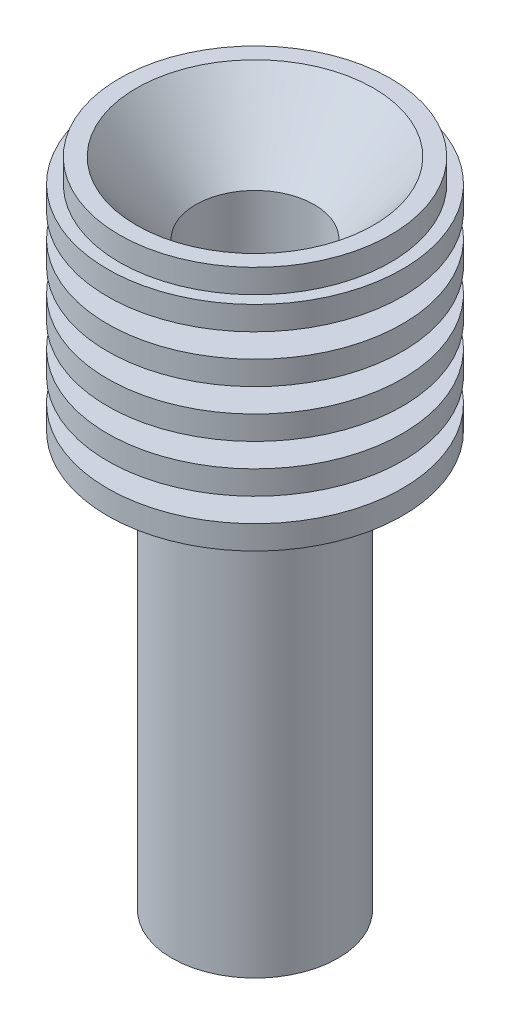
ISO-10303-21;
HEADER;
FILE_DESCRIPTION(('STEP AP214'),'2;1');
FILE_NAME('part.step','',(''),(''),'','','');
FILE_SCHEMA(('AUTOMOTIVE_DESIGN { 1 0 10303 214 1 1 1 1 }'));
ENDSEC;
DATA;
#1=APPLICATION_CONTEXT('core data for automotive mechanical design processes');
#2=APPLICATION_PROTOCOL_DEFINITION('international standard','automotive_design',2000,#1);
#3=PRODUCT_CONTEXT('',#1,'mechanical');
#4=PRODUCT('Part','Part','',(#3));
#5=PRODUCT_RELATED_PRODUCT_CATEGORY('part','',(#4));
#6=PRODUCT_DEFINITION_FORMATION('','',#4);
#7=PRODUCT_DEFINITION_CONTEXT('part definition',#1,'design');
#8=PRODUCT_DEFINITION('design','',#6,#7);
#9=PRODUCT_DEFINITION_SHAPE('','',#8);
#10=(LENGTH_UNIT() NAMED_UNIT(*) SI_UNIT(.MILLI.,.METRE.));
#11=(NAMED_UNIT(*) PLANE_ANGLE_UNIT() SI_UNIT($,.RADIAN.));
#12=(NAMED_UNIT(*) SI_UNIT($,.STERADIAN.) SOLID_ANGLE_UNIT());
#13=UNCERTAINTY_MEASURE_WITH_UNIT(LENGTH_MEASURE(1.E-05),#10,'distance_accuracy_value','');
#14=(GEOMETRIC_REPRESENTATION_CONTEXT(3) GLOBAL_UNCERTAINTY_ASSIGNED_CONTEXT((#13)) GLOBAL_UNIT_ASSIGNED_CONTEXT((#10,
#11,#12)) REPRESENTATION_CONTEXT('',''));
#15=CARTESIAN_POINT('',(0.,0.,0.));
#16=DIRECTION('',(0.,0.,1.));
#17=DIRECTION('',(1.,0.,0.));
#18=AXIS2_PLACEMENT_3D('',#15,#16,#17);
#19=CARTESIAN_POINT('',(0.,35.,0.));
#20=DIRECTION('',(0.,1.,0.));
#21=DIRECTION('',(0.,0.,1.));
#22=AXIS2_PLACEMENT_3D('',#19,#20,#21);
#23=CYLINDRICAL_SURFACE('',#22,12.425);
#24=CARTESIAN_POINT('',(0.,35.,0.));
#25=DIRECTION('',(0.,1.,0.));
#26=DIRECTION('',(0.,0.,1.));
#27=AXIS2_PLACEMENT_3D('',#24,#25,#26);
#28=CIRCLE('',#27,12.425);
#29=CARTESIAN_POINT('',(0.,35.,12.425));
#30=VERTEX_POINT('',#29);
#31=EDGE_CURVE('E52',#30,#30,#28,.T.);
#32=ORIENTED_EDGE('',*,*,#31,.T.);
#33=EDGE_LOOP('',(#32));
#34=FACE_BOUND('',#33,.T.);
#35=CARTESIAN_POINT('',(0.,37.,0.));
#36=DIRECTION('',(0.,1.,0.));
#37=DIRECTION('',(0.,0.,1.));
#38=AXIS2_PLACEMENT_3D('',#35,#36,#37);
#39=CIRCLE('',#38,12.425);
#40=CARTESIAN_POINT('',(0.,37.,12.425));
#41=VERTEX_POINT('',#40);
#42=EDGE_CURVE('E44',#41,#41,#39,.F.);
#43=ORIENTED_EDGE('',*,*,#42,.T.);
#44=EDGE_LOOP('',(#43));
#45=FACE_BOUND('',#44,.T.);
#46=ADVANCED_FACE('F40',(#34,#45),#23,.T.);
#47=CARTESIAN_POINT('',(0.,8.,0.));
#48=DIRECTION('',(0.,1.,0.));
#49=DIRECTION('',(0.,0.,1.));
#50=AXIS2_PLACEMENT_3D('',#47,#48,#49);
#51=CYLINDRICAL_SURFACE('',#50,5.);
#52=CARTESIAN_POINT('',(0.,8.,0.));
#53=DIRECTION('',(0.,1.,0.));
#54=DIRECTION('',(0.,0.,1.));
#55=AXIS2_PLACEMENT_3D('',#52,#53,#54);
#56=CIRCLE('',#55,5.);
#57=CARTESIAN_POINT('',(0.,8.,5.));
#58=VERTEX_POINT('',#57);
#59=EDGE_CURVE('E57',#58,#58,#56,.T.);
#60=ORIENTED_EDGE('',*,*,#59,.F.);
#61=EDGE_LOOP('',(#60));
#62=FACE_BOUND('',#61,.T.);
#63=CARTESIAN_POINT('',(0.,49.,0.));
#64=DIRECTION('',(0.,-1.,0.));
#65=DIRECTION('',(0.,0.,-1.));
#66=AXIS2_PLACEMENT_3D('',#63,#64,#65);
#67=CIRCLE('',#66,5.);
#68=CARTESIAN_POINT('',(0.,49.,-5.));
#69=VERTEX_POINT('',#68);
#70=EDGE_CURVE('E66',#69,#69,#67,.T.);
#71=ORIENTED_EDGE('',*,*,#70,.F.);
#72=EDGE_LOOP('',(#71));
#73=FACE_BOUND('',#72,.T.);
#74=ADVANCED_FACE('F147',(#62,#73),#51,.F.);
#75=CARTESIAN_POINT('',(0.,55.,0.));
#76=DIRECTION('',(0.,-1.,0.));
#77=DIRECTION('',(0.,0.,-1.));
#78=AXIS2_PLACEMENT_3D('',#75,#76,#77);
#79=CYLINDRICAL_SURFACE('',#78,7.);
#80=CARTESIAN_POINT('',(0.,0.,0.));
#81=DIRECTION('',(0.,1.,0.));
#82=DIRECTION('',(0.,0.,1.));
#83=AXIS2_PLACEMENT_3D('',#80,#81,#82);
#84=CIRCLE('',#83,7.);
#85=CARTESIAN_POINT('',(0.,0.,7.));
#86=VERTEX_POINT('',#85);
#87=EDGE_CURVE('E48',#86,#86,#84,.T.);
#88=ORIENTED_EDGE('',*,*,#87,.T.);
#89=EDGE_LOOP('',(#88));
#90=FACE_BOUND('',#89,.T.);
#91=CARTESIAN_POINT('',(0.,35.,0.));
#92=DIRECTION('',(0.,1.,0.));
#93=DIRECTION('',(0.,0.,1.));
#94=AXIS2_PLACEMENT_3D('',#91,#92,#93);
#95=CIRCLE('',#94,7.);
#96=CARTESIAN_POINT('',(0.,35.,7.));
#97=VERTEX_POINT('',#96);
#98=EDGE_CURVE('E11',#97,#97,#95,.T.);
#99=ORIENTED_EDGE('',*,*,#98,.F.);
#100=EDGE_LOOP('',(#99));
#101=FACE_BOUND('',#100,.T.);
#102=ADVANCED_FACE('F42',(#90,#101),#79,.T.);
#103=CARTESIAN_POINT('',(0.,0.,0.));
#104=DIRECTION('',(0.,1.,0.));
#105=DIRECTION('',(0.,0.,1.));
#106=AXIS2_PLACEMENT_3D('',#103,#104,#105);
#107=PLANE('',#106);
#108=CARTESIAN_POINT('',(0.,0.,0.));
#109=DIRECTION('',(0.,-1.,0.));
#110=DIRECTION('',(0.,0.,-1.));
#111=AXIS2_PLACEMENT_3D('',#108,#109,#110);
#112=CIRCLE('',#111,3.);
#113=CARTESIAN_POINT('',(0.,0.,-3.));
#114=VERTEX_POINT('',#113);
#115=EDGE_CURVE('E63',#114,#114,#112,.T.);
#116=ORIENTED_EDGE('',*,*,#115,.F.);
#117=EDGE_LOOP('',(#116));
#118=FACE_BOUND('',#117,.T.);
#119=ORIENTED_EDGE('',*,*,#87,.F.);
#120=EDGE_LOOP('',(#119));
#121=FACE_BOUND('',#120,.T.);
#122=ADVANCED_FACE('F397',(#118,#121),#107,.F.);
#123=CARTESIAN_POINT('',(0.,35.,0.));
#124=DIRECTION('',(0.,1.,0.));
#125=DIRECTION('',(0.,0.,1.));
#126=AXIS2_PLACEMENT_3D('',#123,#124,#125);
#127=PLANE('',#126);
#128=ORIENTED_EDGE('',*,*,#98,.T.);
#129=EDGE_LOOP('',(#128));
#130=FACE_BOUND('',#129,.T.);
#131=ORIENTED_EDGE('',*,*,#31,.F.);
#132=EDGE_LOOP('',(#131));
#133=FACE_BOUND('',#132,.T.);
#134=ADVANCED_FACE('F388',(#130,#133),#127,.F.);
#135=CARTESIAN_POINT('',(0.,8.,0.));
#136=DIRECTION('',(0.,1.,0.));
#137=DIRECTION('',(0.,0.,1.));
#138=AXIS2_PLACEMENT_3D('',#135,#136,#137);
#139=PLANE('',#138);
#140=CARTESIAN_POINT('',(0.,8.,0.));
#141=DIRECTION('',(0.,1.,0.));
#142=DIRECTION('',(0.,0.,1.));
#143=AXIS2_PLACEMENT_3D('',#140,#141,#142);
#144=CIRCLE('',#143,3.);
#145=CARTESIAN_POINT('',(0.,8.,3.));
#146=VERTEX_POINT('',#145);
#147=EDGE_CURVE('E60',#146,#146,#144,.F.);
#148=ORIENTED_EDGE('',*,*,#147,.T.);
#149=EDGE_LOOP('',(#148));
#150=FACE_BOUND('',#149,.T.);
#151=ORIENTED_EDGE('',*,*,#59,.T.);
#152=EDGE_LOOP('',(#151));
#153=FACE_BOUND('',#152,.T.);
#154=ADVANCED_FACE('F142',(#150,#153),#139,.T.);
#155=CARTESIAN_POINT('',(0.,16.4852813742386,0.));
#156=DIRECTION('',(0.,-1.,0.));
#157=DIRECTION('',(0.,0.,-1.));
#158=AXIS2_PLACEMENT_3D('',#155,#156,#157);
#159=CYLINDRICAL_SURFACE('',#158,3.);
#160=ORIENTED_EDGE('',*,*,#115,.T.);
#161=EDGE_LOOP('',(#160));
#162=FACE_BOUND('',#161,.T.);
#163=ORIENTED_EDGE('',*,*,#147,.F.);
#164=EDGE_LOOP('',(#163));
#165=FACE_BOUND('',#164,.T.);
#166=ADVANCED_FACE('F131',(#162,#165),#159,.F.);
#167=CARTESIAN_POINT('',(0.,55.,0.));
#168=DIRECTION('',(0.,1.,0.));
#169=DIRECTION('',(0.,0.,1.));
#170=AXIS2_PLACEMENT_3D('',#167,#168,#169);
#171=CONICAL_SURFACE('',#170,10.,0.694738276196703);
#172=ORIENTED_EDGE('',*,*,#70,.T.);
#173=EDGE_LOOP('',(#172));
#174=FACE_BOUND('',#173,.T.);
#175=CARTESIAN_POINT('',(0.,55.,0.));
#176=DIRECTION('',(0.,-1.,0.));
#177=DIRECTION('',(0.,0.,-1.));
#178=AXIS2_PLACEMENT_3D('',#175,#176,#177);
#179=CIRCLE('',#178,10.);
#180=CARTESIAN_POINT('',(0.,55.,-10.));
#181=VERTEX_POINT('',#180);
#182=EDGE_CURVE('E123',#181,#181,#179,.T.);
#183=ORIENTED_EDGE('',*,*,#182,.F.);
#184=EDGE_LOOP('',(#183));
#185=FACE_BOUND('',#184,.T.);
#186=ADVANCED_FACE('F129',(#174,#185),#171,.F.);
#187=CARTESIAN_POINT('',(0.,55.,0.));
#188=DIRECTION('',(0.,1.,0.));
#189=DIRECTION('',(0.,0.,1.));
#190=AXIS2_PLACEMENT_3D('',#187,#188,#189);
#191=PLANE('',#190);
#192=CARTESIAN_POINT('',(0.,55.,0.));
#193=DIRECTION('',(0.,-1.,0.));
#194=DIRECTION('',(0.,0.,-1.));
#195=AXIS2_PLACEMENT_3D('',#192,#193,#194);
#196=CIRCLE('',#195,11.425);
#197=CARTESIAN_POINT('',(0.,55.,-11.425));
#198=VERTEX_POINT('',#197);
#199=EDGE_CURVE('E120',#198,#198,#196,.T.);
#200=ORIENTED_EDGE('',*,*,#199,.F.);
#201=EDGE_LOOP('',(#200));
#202=FACE_BOUND('',#201,.T.);
#203=ORIENTED_EDGE('',*,*,#182,.T.);
#204=EDGE_LOOP('',(#203));
#205=FACE_BOUND('',#204,.T.);
#206=ADVANCED_FACE('F127',(#202,#205),#191,.T.);
#207=CARTESIAN_POINT('',(0.,0.,0.));
#208=DIRECTION('',(0.,-1.,0.));
#209=DIRECTION('',(0.,0.,-1.));
#210=AXIS2_PLACEMENT_3D('',#207,#208,#209);
#211=CYLINDRICAL_SURFACE('',#210,11.425);
#212=ORIENTED_EDGE('',*,*,#199,.T.);
#213=EDGE_LOOP('',(#212));
#214=FACE_BOUND('',#213,.T.);
#215=CARTESIAN_POINT('',(0.,53.,0.));
#216=DIRECTION('',(0.,-1.,0.));
#217=DIRECTION('',(0.,0.,-1.));
#218=AXIS2_PLACEMENT_3D('',#215,#216,#217);
#219=CIRCLE('',#218,11.425);
#220=CARTESIAN_POINT('',(0.,53.,-11.425));
#221=VERTEX_POINT('',#220);
#222=EDGE_CURVE('E117',#221,#221,#219,.T.);
#223=ORIENTED_EDGE('',*,*,#222,.F.);
#224=EDGE_LOOP('',(#223));
#225=FACE_BOUND('',#224,.T.);
#226=ADVANCED_FACE('F138',(#214,#225),#211,.T.);
#227=CARTESIAN_POINT('',(-11.425,53.,0.));
#228=DIRECTION('',(0.,1.,0.));
#229=DIRECTION('',(0.,0.,1.));
#230=AXIS2_PLACEMENT_3D('',#227,#228,#229);
#231=PLANE('',#230);
#232=ORIENTED_EDGE('',*,*,#222,.T.);
#233=EDGE_LOOP('',(#232));
#234=FACE_BOUND('',#233,.T.);
#235=CARTESIAN_POINT('',(0.,53.,0.));
#236=DIRECTION('',(0.,-1.,0.));
#237=DIRECTION('',(0.,0.,-1.));
#238=AXIS2_PLACEMENT_3D('',#235,#236,#237);
#239=CIRCLE('',#238,12.425);
#240=CARTESIAN_POINT('',(0.,53.,-12.425));
#241=VERTEX_POINT('',#240);
#242=EDGE_CURVE('E114',#241,#241,#239,.T.);
#243=ORIENTED_EDGE('',*,*,#242,.F.);
#244=EDGE_LOOP('',(#243));
#245=FACE_BOUND('',#244,.T.);
#246=ADVANCED_FACE('F165',(#234,#245),#231,.T.);
#247=ORIENTED_EDGE('',*,*,#242,.T.);
#248=EDGE_LOOP('',(#247));
#249=FACE_BOUND('',#248,.T.);
#250=CARTESIAN_POINT('',(0.,51.,0.));
#251=DIRECTION('',(0.,-1.,0.));
#252=DIRECTION('',(0.,0.,-1.));
#253=AXIS2_PLACEMENT_3D('',#250,#251,#252);
#254=CIRCLE('',#253,12.425);
#255=CARTESIAN_POINT('',(0.,51.,-12.425));
#256=VERTEX_POINT('',#255);
#257=EDGE_CURVE('E111',#256,#256,#254,.T.);
#258=ORIENTED_EDGE('',*,*,#257,.F.);
#259=EDGE_LOOP('',(#258));
#260=FACE_BOUND('',#259,.T.);
#261=ADVANCED_FACE('F151',(#249,#260),#23,.T.);
#262=CARTESIAN_POINT('',(-8.025,49.,0.));
#263=DIRECTION('',(0.,1.,0.));
#264=DIRECTION('',(0.,0.,1.));
#265=AXIS2_PLACEMENT_3D('',#262,#263,#264);
#266=PLANE('',#265);
#267=CARTESIAN_POINT('',(0.,49.,0.));
#268=DIRECTION('',(0.,-1.,0.));
#269=DIRECTION('',(0.,0.,-1.));
#270=AXIS2_PLACEMENT_3D('',#267,#268,#269);
#271=CIRCLE('',#270,8.025);
#272=CARTESIAN_POINT('',(0.,49.,-8.025));
#273=VERTEX_POINT('',#272);
#274=EDGE_CURVE('E105',#273,#273,#271,.T.);
#275=ORIENTED_EDGE('',*,*,#274,.T.);
#276=EDGE_LOOP('',(#275));
#277=FACE_BOUND('',#276,.T.);
#278=CARTESIAN_POINT('',(0.,49.,0.));
#279=DIRECTION('',(0.,-1.,0.));
#280=DIRECTION('',(0.,0.,-1.));
#281=AXIS2_PLACEMENT_3D('',#278,#279,#280);
#282=CIRCLE('',#281,12.425);
#283=CARTESIAN_POINT('',(0.,49.,-12.425));
#284=VERTEX_POINT('',#283);
#285=EDGE_CURVE('E102',#284,#284,#282,.T.);
#286=ORIENTED_EDGE('',*,*,#285,.F.);
#287=EDGE_LOOP('',(#286));
#288=FACE_BOUND('',#287,.T.);
#289=ADVANCED_FACE('F164',(#277,#288),#266,.T.);
#290=CARTESIAN_POINT('',(0.,0.,0.));
#291=DIRECTION('',(0.,-1.,0.));
#292=DIRECTION('',(0.,0.,-1.));
#293=AXIS2_PLACEMENT_3D('',#290,#291,#292);
#294=CYLINDRICAL_SURFACE('',#293,8.025);
#295=CARTESIAN_POINT('',(0.,51.,0.));
#296=DIRECTION('',(0.,-1.,0.));
#297=DIRECTION('',(0.,0.,-1.));
#298=AXIS2_PLACEMENT_3D('',#295,#296,#297);
#299=CIRCLE('',#298,8.025);
#300=CARTESIAN_POINT('',(0.,51.,-8.025));
#301=VERTEX_POINT('',#300);
#302=EDGE_CURVE('E108',#301,#301,#299,.T.);
#303=ORIENTED_EDGE('',*,*,#302,.T.);
#304=EDGE_LOOP('',(#303));
#305=FACE_BOUND('',#304,.T.);
#306=ORIENTED_EDGE('',*,*,#274,.F.);
#307=EDGE_LOOP('',(#306));
#308=FACE_BOUND('',#307,.T.);
#309=ADVANCED_FACE('F172',(#305,#308),#294,.T.);
#310=CARTESIAN_POINT('',(-12.425,51.,0.));
#311=DIRECTION('',(0.,-1.,0.));
#312=DIRECTION('',(0.,0.,-1.));
#313=AXIS2_PLACEMENT_3D('',#310,#311,#312);
#314=PLANE('',#313);
#315=ORIENTED_EDGE('',*,*,#257,.T.);
#316=EDGE_LOOP('',(#315));
#317=FACE_BOUND('',#316,.T.);
#318=ORIENTED_EDGE('',*,*,#302,.F.);
#319=EDGE_LOOP('',(#318));
#320=FACE_BOUND('',#319,.T.);
#321=ADVANCED_FACE('F180',(#317,#320),#314,.T.);
#322=ORIENTED_EDGE('',*,*,#285,.T.);
#323=EDGE_LOOP('',(#322));
#324=FACE_BOUND('',#323,.T.);
#325=CARTESIAN_POINT('',(0.,47.,0.));
#326=DIRECTION('',(0.,-1.,0.));
#327=DIRECTION('',(0.,0.,-1.));
#328=AXIS2_PLACEMENT_3D('',#325,#326,#327);
#329=CIRCLE('',#328,12.425);
#330=CARTESIAN_POINT('',(0.,47.,-12.425));
#331=VERTEX_POINT('',#330);
#332=EDGE_CURVE('E99',#331,#331,#329,.T.);
#333=ORIENTED_EDGE('',*,*,#332,.F.);
#334=EDGE_LOOP('',(#333));
#335=FACE_BOUND('',#334,.T.);
#336=ADVANCED_FACE('F167',(#324,#335),#23,.T.);
#337=CARTESIAN_POINT('',(-7.,45.,0.));
#338=DIRECTION('',(0.,1.,0.));
#339=DIRECTION('',(0.,0.,1.));
#340=AXIS2_PLACEMENT_3D('',#337,#338,#339);
#341=PLANE('',#340);
#342=CARTESIAN_POINT('',(0.,45.,0.));
#343=DIRECTION('',(0.,-1.,0.));
#344=DIRECTION('',(0.,0.,-1.));
#345=AXIS2_PLACEMENT_3D('',#342,#343,#344);
#346=CIRCLE('',#345,7.);
#347=CARTESIAN_POINT('',(0.,45.,-7.));
#348=VERTEX_POINT('',#347);
#349=EDGE_CURVE('E93',#348,#348,#346,.T.);
#350=ORIENTED_EDGE('',*,*,#349,.T.);
#351=EDGE_LOOP('',(#350));
#352=FACE_BOUND('',#351,.T.);
#353=CARTESIAN_POINT('',(0.,45.,0.));
#354=DIRECTION('',(0.,-1.,0.));
#355=DIRECTION('',(0.,0.,-1.));
#356=AXIS2_PLACEMENT_3D('',#353,#354,#355);
#357=CIRCLE('',#356,12.425);
#358=CARTESIAN_POINT('',(0.,45.,-12.425));
#359=VERTEX_POINT('',#358);
#360=EDGE_CURVE('E90',#359,#359,#357,.T.);
#361=ORIENTED_EDGE('',*,*,#360,.F.);
#362=EDGE_LOOP('',(#361));
#363=FACE_BOUND('',#362,.T.);
#364=ADVANCED_FACE('F179',(#352,#363),#341,.T.);
#365=CARTESIAN_POINT('',(0.,0.,0.));
#366=DIRECTION('',(0.,-1.,0.));
#367=DIRECTION('',(0.,0.,-1.));
#368=AXIS2_PLACEMENT_3D('',#365,#366,#367);
#369=CYLINDRICAL_SURFACE('',#368,7.);
#370=CARTESIAN_POINT('',(0.,47.,0.));
#371=DIRECTION('',(0.,-1.,0.));
#372=DIRECTION('',(0.,0.,-1.));
#373=AXIS2_PLACEMENT_3D('',#370,#371,#372);
#374=CIRCLE('',#373,7.);
#375=CARTESIAN_POINT('',(0.,47.,-7.));
#376=VERTEX_POINT('',#375);
#377=EDGE_CURVE('E96',#376,#376,#374,.T.);
#378=ORIENTED_EDGE('',*,*,#377,.T.);
#379=EDGE_LOOP('',(#378));
#380=FACE_BOUND('',#379,.T.);
#381=ORIENTED_EDGE('',*,*,#349,.F.);
#382=EDGE_LOOP('',(#381));
#383=FACE_BOUND('',#382,.T.);
#384=ADVANCED_FACE('F186',(#380,#383),#369,.T.);
#385=CARTESIAN_POINT('',(-12.425,47.,0.));
#386=DIRECTION('',(0.,-1.,0.));
#387=DIRECTION('',(0.,0.,-1.));
#388=AXIS2_PLACEMENT_3D('',#385,#386,#387);
#389=PLANE('',#388);
#390=ORIENTED_EDGE('',*,*,#332,.T.);
#391=EDGE_LOOP('',(#390));
#392=FACE_BOUND('',#391,.T.);
#393=ORIENTED_EDGE('',*,*,#377,.F.);
#394=EDGE_LOOP('',(#393));
#395=FACE_BOUND('',#394,.T.);
#396=ADVANCED_FACE('F194',(#392,#395),#389,.T.);
#397=ORIENTED_EDGE('',*,*,#360,.T.);
#398=EDGE_LOOP('',(#397));
#399=FACE_BOUND('',#398,.T.);
#400=CARTESIAN_POINT('',(0.,43.,0.));
#401=DIRECTION('',(0.,-1.,0.));
#402=DIRECTION('',(0.,0.,-1.));
#403=AXIS2_PLACEMENT_3D('',#400,#401,#402);
#404=CIRCLE('',#403,12.425);
#405=CARTESIAN_POINT('',(0.,43.,-12.425));
#406=VERTEX_POINT('',#405);
#407=EDGE_CURVE('E87',#406,#406,#404,.T.);
#408=ORIENTED_EDGE('',*,*,#407,.F.);
#409=EDGE_LOOP('',(#408));
#410=FACE_BOUND('',#409,.T.);
#411=ADVANCED_FACE('F162',(#399,#410),#23,.T.);
#412=CARTESIAN_POINT('',(-7.,41.,0.));
#413=DIRECTION('',(0.,1.,0.));
#414=DIRECTION('',(0.,0.,1.));
#415=AXIS2_PLACEMENT_3D('',#412,#413,#414);
#416=PLANE('',#415);
#417=CARTESIAN_POINT('',(0.,41.,0.));
#418=DIRECTION('',(0.,-1.,0.));
#419=DIRECTION('',(0.,0.,-1.));
#420=AXIS2_PLACEMENT_3D('',#417,#418,#419);
#421=CIRCLE('',#420,7.);
#422=CARTESIAN_POINT('',(0.,41.,-7.));
#423=VERTEX_POINT('',#422);
#424=EDGE_CURVE('E81',#423,#423,#421,.T.);
#425=ORIENTED_EDGE('',*,*,#424,.T.);
#426=EDGE_LOOP('',(#425));
#427=FACE_BOUND('',#426,.T.);
#428=CARTESIAN_POINT('',(0.,41.,0.));
#429=DIRECTION('',(0.,-1.,0.));
#430=DIRECTION('',(0.,0.,-1.));
#431=AXIS2_PLACEMENT_3D('',#428,#429,#430);
#432=CIRCLE('',#431,12.425);
#433=CARTESIAN_POINT('',(0.,41.,-12.425));
#434=VERTEX_POINT('',#433);
#435=EDGE_CURVE('E78',#434,#434,#432,.T.);
#436=ORIENTED_EDGE('',*,*,#435,.F.);
#437=EDGE_LOOP('',(#436));
#438=FACE_BOUND('',#437,.T.);
#439=ADVANCED_FACE('F193',(#427,#438),#416,.T.);
#440=CARTESIAN_POINT('',(0.,0.,0.));
#441=DIRECTION('',(0.,-1.,0.));
#442=DIRECTION('',(0.,0.,-1.));
#443=AXIS2_PLACEMENT_3D('',#440,#441,#442);
#444=CYLINDRICAL_SURFACE('',#443,7.);
#445=CARTESIAN_POINT('',(0.,43.,0.));
#446=DIRECTION('',(0.,-1.,0.));
#447=DIRECTION('',(0.,0.,-1.));
#448=AXIS2_PLACEMENT_3D('',#445,#446,#447);
#449=CIRCLE('',#448,7.);
#450=CARTESIAN_POINT('',(0.,43.,-7.));
#451=VERTEX_POINT('',#450);
#452=EDGE_CURVE('E84',#451,#451,#449,.T.);
#453=ORIENTED_EDGE('',*,*,#452,.T.);
#454=EDGE_LOOP('',(#453));
#455=FACE_BOUND('',#454,.T.);
#456=ORIENTED_EDGE('',*,*,#424,.F.);
#457=EDGE_LOOP('',(#456));
#458=FACE_BOUND('',#457,.T.);
#459=ADVANCED_FACE('F200',(#455,#458),#444,.T.);
#460=CARTESIAN_POINT('',(-12.425,43.,0.));
#461=DIRECTION('',(0.,-1.,0.));
#462=DIRECTION('',(0.,0.,-1.));
#463=AXIS2_PLACEMENT_3D('',#460,#461,#462);
#464=PLANE('',#463);
#465=ORIENTED_EDGE('',*,*,#407,.T.);
#466=EDGE_LOOP('',(#465));
#467=FACE_BOUND('',#466,.T.);
#468=ORIENTED_EDGE('',*,*,#452,.F.);
#469=EDGE_LOOP('',(#468));
#470=FACE_BOUND('',#469,.T.);
#471=ADVANCED_FACE('F160',(#467,#470),#464,.T.);
#472=ORIENTED_EDGE('',*,*,#435,.T.);
#473=EDGE_LOOP('',(#472));
#474=FACE_BOUND('',#473,.T.);
#475=CARTESIAN_POINT('',(0.,39.,0.));
#476=DIRECTION('',(0.,-1.,0.));
#477=DIRECTION('',(0.,0.,-1.));
#478=AXIS2_PLACEMENT_3D('',#475,#476,#477);
#479=CIRCLE('',#478,12.425);
#480=CARTESIAN_POINT('',(0.,39.,-12.425));
#481=VERTEX_POINT('',#480);
#482=EDGE_CURVE('E75',#481,#481,#479,.T.);
#483=ORIENTED_EDGE('',*,*,#482,.F.);
#484=EDGE_LOOP('',(#483));
#485=FACE_BOUND('',#484,.T.);
#486=ADVANCED_FACE('F150',(#474,#485),#23,.T.);
#487=CARTESIAN_POINT('',(-7.,37.,0.));
#488=DIRECTION('',(0.,1.,0.));
#489=DIRECTION('',(0.,0.,1.));
#490=AXIS2_PLACEMENT_3D('',#487,#488,#489);
#491=PLANE('',#490);
#492=ORIENTED_EDGE('',*,*,#42,.F.);
#493=EDGE_LOOP('',(#492));
#494=FACE_BOUND('',#493,.T.);
#495=CARTESIAN_POINT('',(0.,37.,0.));
#496=DIRECTION('',(0.,-1.,0.));
#497=DIRECTION('',(0.,0.,-1.));
#498=AXIS2_PLACEMENT_3D('',#495,#496,#497);
#499=CIRCLE('',#498,7.);
#500=CARTESIAN_POINT('',(0.,37.,-7.));
#501=VERTEX_POINT('',#500);
#502=EDGE_CURVE('E69',#501,#501,#499,.T.);
#503=ORIENTED_EDGE('',*,*,#502,.T.);
#504=EDGE_LOOP('',(#503));
#505=FACE_BOUND('',#504,.T.);
#506=ADVANCED_FACE('F159',(#494,#505),#491,.T.);
#507=CARTESIAN_POINT('',(0.,0.,0.));
#508=DIRECTION('',(0.,-1.,0.));
#509=DIRECTION('',(0.,0.,-1.));
#510=AXIS2_PLACEMENT_3D('',#507,#508,#509);
#511=CYLINDRICAL_SURFACE('',#510,7.);
#512=CARTESIAN_POINT('',(0.,39.,0.));
#513=DIRECTION('',(0.,-1.,0.));
#514=DIRECTION('',(0.,0.,-1.));
#515=AXIS2_PLACEMENT_3D('',#512,#513,#514);
#516=CIRCLE('',#515,7.);
#517=CARTESIAN_POINT('',(0.,39.,-7.));
#518=VERTEX_POINT('',#517);
#519=EDGE_CURVE('E72',#518,#518,#516,.T.);
#520=ORIENTED_EDGE('',*,*,#519,.T.);
#521=EDGE_LOOP('',(#520));
#522=FACE_BOUND('',#521,.T.);
#523=ORIENTED_EDGE('',*,*,#502,.F.);
#524=EDGE_LOOP('',(#523));
#525=FACE_BOUND('',#524,.T.);
#526=ADVANCED_FACE('F226',(#522,#525),#511,.T.);
#527=CARTESIAN_POINT('',(-12.425,39.,0.));
#528=DIRECTION('',(0.,-1.,0.));
#529=DIRECTION('',(0.,0.,-1.));
#530=AXIS2_PLACEMENT_3D('',#527,#528,#529);
#531=PLANE('',#530);
#532=ORIENTED_EDGE('',*,*,#482,.T.);
#533=EDGE_LOOP('',(#532));
#534=FACE_BOUND('',#533,.T.);
#535=ORIENTED_EDGE('',*,*,#519,.F.);
#536=EDGE_LOOP('',(#535));
#537=FACE_BOUND('',#536,.T.);
#538=ADVANCED_FACE('F223',(#534,#537),#531,.T.);
#539=CLOSED_SHELL('',(#46,#74,#102,#122,#134,#154,#166,#186,#206,#226,#246,#261,#289,#309,#321,
#336,#364,#384,#396,#411,#439,#459,#471,#486,#506,#526,#538));
#540=MANIFOLD_SOLID_BREP('B2',#539);
#541=ADVANCED_BREP_SHAPE_REPRESENTATION('',(#18,#540),#14);
#542=SHAPE_DEFINITION_REPRESENTATION(#9,#541);
ENDSEC;
END-ISO-10303-21;
